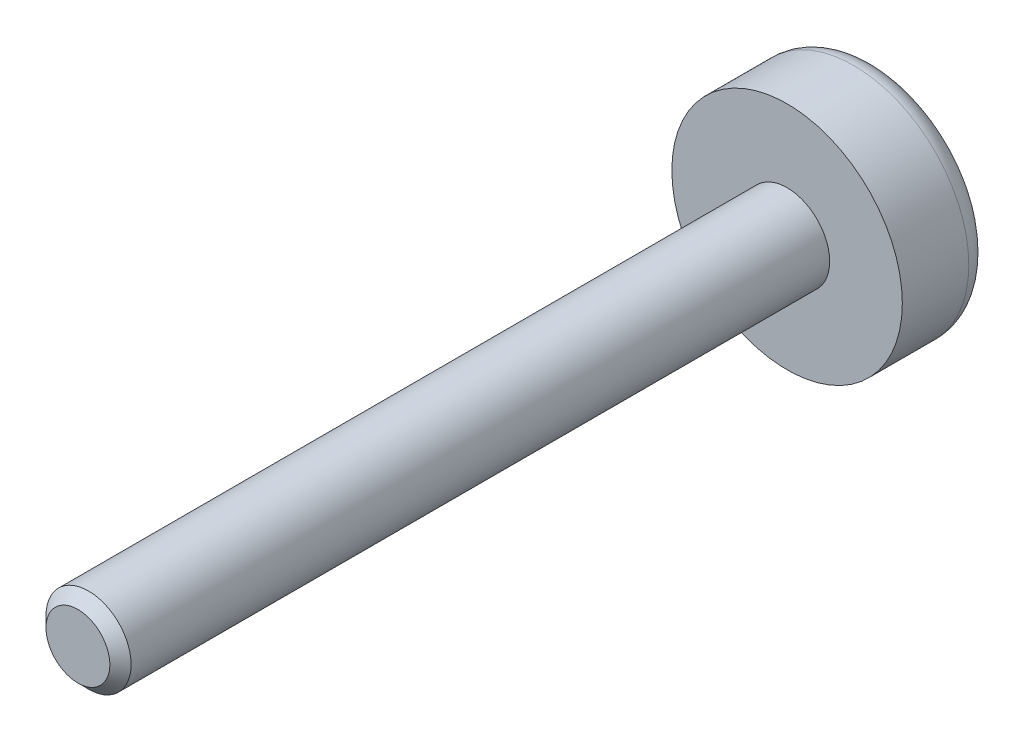
ISO-10303-21;
HEADER;
FILE_DESCRIPTION(('STEP AP214'),'2;1');
FILE_NAME('part.step','',(''),(''),'','','');
FILE_SCHEMA(('AUTOMOTIVE_DESIGN { 1 0 10303 214 1 1 1 1 }'));
ENDSEC;
DATA;
#1=APPLICATION_CONTEXT('core data for automotive mechanical design processes');
#2=APPLICATION_PROTOCOL_DEFINITION('international standard','automotive_design',2000,#1);
#3=PRODUCT_CONTEXT('',#1,'mechanical');
#4=PRODUCT('Part','Part','',(#3));
#5=PRODUCT_RELATED_PRODUCT_CATEGORY('part','',(#4));
#6=PRODUCT_DEFINITION_FORMATION('','',#4);
#7=PRODUCT_DEFINITION_CONTEXT('part definition',#1,'design');
#8=PRODUCT_DEFINITION('design','',#6,#7);
#9=PRODUCT_DEFINITION_SHAPE('','',#8);
#10=(LENGTH_UNIT() NAMED_UNIT(*) SI_UNIT(.MILLI.,.METRE.));
#11=(NAMED_UNIT(*) PLANE_ANGLE_UNIT() SI_UNIT($,.RADIAN.));
#12=(NAMED_UNIT(*) SI_UNIT($,.STERADIAN.) SOLID_ANGLE_UNIT());
#13=UNCERTAINTY_MEASURE_WITH_UNIT(LENGTH_MEASURE(1.E-05),#10,'distance_accuracy_value','');
#14=(GEOMETRIC_REPRESENTATION_CONTEXT(3) GLOBAL_UNCERTAINTY_ASSIGNED_CONTEXT((#13)) GLOBAL_UNIT_ASSIGNED_CONTEXT((#10,
#11,#12)) REPRESENTATION_CONTEXT('',''));
#15=CARTESIAN_POINT('',(0.,0.,0.));
#16=DIRECTION('',(0.,0.,1.));
#17=DIRECTION('',(1.,0.,0.));
#18=AXIS2_PLACEMENT_3D('',#15,#16,#17);
#19=CARTESIAN_POINT('',(0.,0.,20.));
#20=DIRECTION('',(0.,0.,1.));
#21=DIRECTION('',(-1.,0.,0.));
#22=AXIS2_PLACEMENT_3D('',#19,#20,#21);
#23=PLANE('',#22);
#24=CARTESIAN_POINT('',(0.,0.,20.));
#25=DIRECTION('',(0.,0.,-1.));
#26=DIRECTION('',(-1.,0.,0.));
#27=AXIS2_PLACEMENT_3D('',#24,#25,#26);
#28=CIRCLE('',#27,0.900000000000005);
#29=CARTESIAN_POINT('',(-0.900000000000005,0.,20.));
#30=VERTEX_POINT('',#29);
#31=EDGE_CURVE('E140',#30,#30,#28,.T.);
#32=ORIENTED_EDGE('',*,*,#31,.F.);
#33=EDGE_LOOP('',(#32));
#34=FACE_BOUND('',#33,.T.);
#35=ADVANCED_FACE('F41',(#34),#23,.T.);
#36=CARTESIAN_POINT('',(0.,0.,-10.123));
#37=DIRECTION('',(0.,0.,-1.));
#38=DIRECTION('',(1.,0.,0.));
#39=AXIS2_PLACEMENT_3D('',#36,#37,#38);
#40=CYLINDRICAL_SURFACE('',#39,1.2);
#41=CARTESIAN_POINT('',(0.,0.,19.7));
#42=DIRECTION('',(0.,0.,-1.));
#43=DIRECTION('',(-1.,0.,0.));
#44=AXIS2_PLACEMENT_3D('',#41,#42,#43);
#45=CIRCLE('',#44,1.2);
#46=CARTESIAN_POINT('',(-1.2,0.,19.7));
#47=VERTEX_POINT('',#46);
#48=EDGE_CURVE('E137',#47,#47,#45,.F.);
#49=ORIENTED_EDGE('',*,*,#48,.F.);
#50=EDGE_LOOP('',(#49));
#51=FACE_BOUND('',#50,.T.);
#52=CARTESIAN_POINT('',(0.,0.,0.));
#53=DIRECTION('',(0.,0.,1.));
#54=DIRECTION('',(1.,0.,0.));
#55=AXIS2_PLACEMENT_3D('',#52,#53,#54);
#56=CIRCLE('',#55,1.2);
#57=CARTESIAN_POINT('',(1.2,0.,0.));
#58=VERTEX_POINT('',#57);
#59=EDGE_CURVE('E134',#58,#58,#56,.T.);
#60=ORIENTED_EDGE('',*,*,#59,.T.);
#61=EDGE_LOOP('',(#60));
#62=FACE_BOUND('',#61,.T.);
#63=ADVANCED_FACE('F163',(#51,#62),#40,.T.);
#64=CARTESIAN_POINT('',(1.2,0.,0.));
#65=DIRECTION('',(0.,0.,1.));
#66=DIRECTION('',(-1.,0.,0.));
#67=AXIS2_PLACEMENT_3D('',#64,#65,#66);
#68=PLANE('',#67);
#69=ORIENTED_EDGE('',*,*,#59,.F.);
#70=EDGE_LOOP('',(#69));
#71=FACE_BOUND('',#70,.T.);
#72=CARTESIAN_POINT('',(0.,0.,0.));
#73=DIRECTION('',(0.,0.,1.));
#74=DIRECTION('',(1.,0.,0.));
#75=AXIS2_PLACEMENT_3D('',#72,#73,#74);
#76=CIRCLE('',#75,3.25);
#77=CARTESIAN_POINT('',(3.25,0.,0.));
#78=VERTEX_POINT('',#77);
#79=EDGE_CURVE('E131',#78,#78,#76,.T.);
#80=ORIENTED_EDGE('',*,*,#79,.T.);
#81=EDGE_LOOP('',(#80));
#82=FACE_BOUND('',#81,.T.);
#83=ADVANCED_FACE('F157',(#71,#82),#68,.T.);
#84=CARTESIAN_POINT('',(0.,0.,-10.123));
#85=DIRECTION('',(0.,0.,-1.));
#86=DIRECTION('',(1.,0.,0.));
#87=AXIS2_PLACEMENT_3D('',#84,#85,#86);
#88=CYLINDRICAL_SURFACE('',#87,3.25);
#89=CARTESIAN_POINT('',(0.,0.,-1.875));
#90=DIRECTION('',(0.,0.,1.));
#91=DIRECTION('',(1.,0.,0.));
#92=AXIS2_PLACEMENT_3D('',#89,#90,#91);
#93=CIRCLE('',#92,3.25);
#94=CARTESIAN_POINT('',(3.25,0.,-1.875));
#95=VERTEX_POINT('',#94);
#96=EDGE_CURVE('E11',#95,#95,#93,.F.);
#97=ORIENTED_EDGE('',*,*,#96,.F.);
#98=EDGE_LOOP('',(#97));
#99=FACE_BOUND('',#98,.T.);
#100=ORIENTED_EDGE('',*,*,#79,.F.);
#101=EDGE_LOOP('',(#100));
#102=FACE_BOUND('',#101,.T.);
#103=ADVANCED_FACE('F149',(#99,#102),#88,.T.);
#104=CARTESIAN_POINT('',(3.25,0.,-2.5));
#105=DIRECTION('',(0.,0.,-1.));
#106=DIRECTION('',(1.,0.,0.));
#107=AXIS2_PLACEMENT_3D('',#104,#105,#106);
#108=PLANE('',#107);
#109=DIRECTION('',(0.499999999999995,0.866025403784441,0.));
#110=VECTOR('',#109,1.);
#111=CARTESIAN_POINT('',(0.577350269189637,-0.999999999999993,-2.5));
#112=LINE('',#111,#110);
#113=CARTESIAN_POINT('',(0.577350269189637,-0.999999999999993,-2.5));
#114=VERTEX_POINT('',#113);
#115=CARTESIAN_POINT('',(1.15470053837925,0.,-2.5));
#116=VERTEX_POINT('',#115);
#117=EDGE_CURVE('E315',#114,#116,#112,.T.);
#118=ORIENTED_EDGE('',*,*,#117,.T.);
#119=DIRECTION('',(-0.500000000000001,0.866025403784438,0.));
#120=VECTOR('',#119,1.);
#121=CARTESIAN_POINT('',(1.15470053837925,0.,-2.5));
#122=LINE('',#121,#120);
#123=CARTESIAN_POINT('',(0.577350269189624,1.,-2.5));
#124=VERTEX_POINT('',#123);
#125=EDGE_CURVE('E310',#116,#124,#122,.T.);
#126=ORIENTED_EDGE('',*,*,#125,.T.);
#127=DIRECTION('',(-1.,0.,0.));
#128=VECTOR('',#127,1.);
#129=CARTESIAN_POINT('',(0.577350269189624,1.,-2.5));
#130=LINE('',#129,#128);
#131=CARTESIAN_POINT('',(-0.57735026918963,0.999999999999998,-2.5));
#132=VERTEX_POINT('',#131);
#133=EDGE_CURVE('E314',#124,#132,#130,.T.);
#134=ORIENTED_EDGE('',*,*,#133,.T.);
#135=DIRECTION('',(-0.499999999999995,-0.866025403784442,0.));
#136=VECTOR('',#135,1.);
#137=CARTESIAN_POINT('',(-0.57735026918963,0.999999999999998,-2.5));
#138=LINE('',#137,#136);
#139=CARTESIAN_POINT('',(-1.15470053837925,0.,-2.5));
#140=VERTEX_POINT('',#139);
#141=EDGE_CURVE('E322',#132,#140,#138,.T.);
#142=ORIENTED_EDGE('',*,*,#141,.T.);
#143=DIRECTION('',(0.500000000000007,-0.866025403784434,0.));
#144=VECTOR('',#143,1.);
#145=CARTESIAN_POINT('',(-1.15470053837925,0.,-2.5));
#146=LINE('',#145,#144);
#147=CARTESIAN_POINT('',(-0.577350269189617,-1.00000000000001,-2.5));
#148=VERTEX_POINT('',#147);
#149=EDGE_CURVE('E120',#140,#148,#146,.T.);
#150=ORIENTED_EDGE('',*,*,#149,.T.);
#151=DIRECTION('',(1.,0.,0.));
#152=VECTOR('',#151,1.);
#153=CARTESIAN_POINT('',(-0.577350269189617,-1.00000000000001,-2.5));
#154=LINE('',#153,#152);
#155=EDGE_CURVE('E317',#148,#114,#154,.T.);
#156=ORIENTED_EDGE('',*,*,#155,.T.);
#157=EDGE_LOOP('',(#118,#126,#134,#142,#150,#156));
#158=FACE_BOUND('',#157,.T.);
#159=CARTESIAN_POINT('',(0.,0.,-2.5));
#160=DIRECTION('',(0.,0.,1.));
#161=DIRECTION('',(1.,0.,0.));
#162=AXIS2_PLACEMENT_3D('',#159,#160,#161);
#163=CIRCLE('',#162,2.625);
#164=CARTESIAN_POINT('',(2.625,0.,-2.5));
#165=VERTEX_POINT('',#164);
#166=EDGE_CURVE('E49',#165,#165,#163,.T.);
#167=ORIENTED_EDGE('',*,*,#166,.F.);
#168=EDGE_LOOP('',(#167));
#169=FACE_BOUND('',#168,.T.);
#170=ADVANCED_FACE('F146',(#158,#169),#108,.T.);
#171=CARTESIAN_POINT('',(0.,0.,19.7));
#172=DIRECTION('',(0.,0.,-1.));
#173=DIRECTION('',(1.,0.,0.));
#174=AXIS2_PLACEMENT_3D('',#171,#172,#173);
#175=CONICAL_SURFACE('',#174,1.2,0.785398163397443);
#176=ORIENTED_EDGE('',*,*,#31,.T.);
#177=EDGE_LOOP('',(#176));
#178=FACE_BOUND('',#177,.T.);
#179=ORIENTED_EDGE('',*,*,#48,.T.);
#180=EDGE_LOOP('',(#179));
#181=FACE_BOUND('',#180,.T.);
#182=ADVANCED_FACE('F148',(#178,#181),#175,.T.);
#183=CARTESIAN_POINT('',(0.,0.,-1.875));
#184=DIRECTION('',(0.,0.,-1.));
#185=DIRECTION('',(1.,0.,0.));
#186=AXIS2_PLACEMENT_3D('',#183,#184,#185);
#187=TOROIDAL_SURFACE('',#186,2.625,0.625);
#188=ORIENTED_EDGE('',*,*,#96,.T.);
#189=EDGE_LOOP('',(#188));
#190=FACE_BOUND('',#189,.T.);
#191=ORIENTED_EDGE('',*,*,#166,.T.);
#192=EDGE_LOOP('',(#191));
#193=FACE_BOUND('',#192,.T.);
#194=ADVANCED_FACE('F43',(#190,#193),#187,.T.);
#195=CARTESIAN_POINT('',(0.577350269189637,-0.999999999999993,-1.125));
#196=DIRECTION('',(0.866025403784441,-0.499999999999995,0.));
#197=DIRECTION('',(0.499999999999995,0.866025403784441,0.));
#198=AXIS2_PLACEMENT_3D('',#195,#196,#197);
#199=PLANE('',#198);
#200=ORIENTED_EDGE('',*,*,#117,.F.);
#201=DIRECTION('',(0.,0.,-1.));
#202=VECTOR('',#201,1.);
#203=CARTESIAN_POINT('',(0.577350269189637,-0.999999999999993,-1.125));
#204=LINE('',#203,#202);
#205=CARTESIAN_POINT('',(0.577350269189637,-0.999999999999993,-1.125));
#206=VERTEX_POINT('',#205);
#207=EDGE_CURVE('E87',#206,#114,#204,.T.);
#208=ORIENTED_EDGE('',*,*,#207,.F.);
#209=DIRECTION('',(0.499999999999995,0.866025403784441,0.));
#210=VECTOR('',#209,1.);
#211=CARTESIAN_POINT('',(0.577350269189637,-0.999999999999993,-1.125));
#212=LINE('',#211,#210);
#213=CARTESIAN_POINT('',(1.15470053837925,0.,-1.125));
#214=VERTEX_POINT('',#213);
#215=EDGE_CURVE('E325',#206,#214,#212,.T.);
#216=ORIENTED_EDGE('',*,*,#215,.T.);
#217=DIRECTION('',(0.,0.,-1.));
#218=VECTOR('',#217,1.);
#219=CARTESIAN_POINT('',(1.15470053837925,0.,-1.125));
#220=LINE('',#219,#218);
#221=EDGE_CURVE('E56',#214,#116,#220,.T.);
#222=ORIENTED_EDGE('',*,*,#221,.T.);
#223=EDGE_LOOP('',(#200,#208,#216,#222));
#224=FACE_BOUND('',#223,.T.);
#225=ADVANCED_FACE('F210',(#224),#199,.F.);
#226=CARTESIAN_POINT('',(-0.577350269189617,-1.00000000000001,-1.125));
#227=DIRECTION('',(0.,-1.,0.));
#228=DIRECTION('',(1.,0.,0.));
#229=AXIS2_PLACEMENT_3D('',#226,#227,#228);
#230=PLANE('',#229);
#231=ORIENTED_EDGE('',*,*,#155,.F.);
#232=DIRECTION('',(0.,0.,-1.));
#233=VECTOR('',#232,1.);
#234=CARTESIAN_POINT('',(-0.577350269189617,-1.00000000000001,-1.125));
#235=LINE('',#234,#233);
#236=CARTESIAN_POINT('',(-0.577350269189617,-1.00000000000001,-1.125));
#237=VERTEX_POINT('',#236);
#238=EDGE_CURVE('E122',#237,#148,#235,.T.);
#239=ORIENTED_EDGE('',*,*,#238,.F.);
#240=DIRECTION('',(1.,0.,0.));
#241=VECTOR('',#240,1.);
#242=CARTESIAN_POINT('',(-0.577350269189617,-1.00000000000001,-1.125));
#243=LINE('',#242,#241);
#244=EDGE_CURVE('E65',#237,#206,#243,.T.);
#245=ORIENTED_EDGE('',*,*,#244,.T.);
#246=ORIENTED_EDGE('',*,*,#207,.T.);
#247=EDGE_LOOP('',(#231,#239,#245,#246));
#248=FACE_BOUND('',#247,.T.);
#249=ADVANCED_FACE('F220',(#248),#230,.F.);
#250=CARTESIAN_POINT('',(-1.15470053837925,0.,-1.125));
#251=DIRECTION('',(-0.866025403784435,-0.500000000000007,0.));
#252=DIRECTION('',(0.500000000000007,-0.866025403784435,0.));
#253=AXIS2_PLACEMENT_3D('',#250,#251,#252);
#254=PLANE('',#253);
#255=ORIENTED_EDGE('',*,*,#149,.F.);
#256=DIRECTION('',(0.,0.,-1.));
#257=VECTOR('',#256,1.);
#258=CARTESIAN_POINT('',(-1.15470053837925,0.,-1.125));
#259=LINE('',#258,#257);
#260=CARTESIAN_POINT('',(-1.15470053837925,0.,-1.125));
#261=VERTEX_POINT('',#260);
#262=EDGE_CURVE('E109',#261,#140,#259,.T.);
#263=ORIENTED_EDGE('',*,*,#262,.F.);
#264=DIRECTION('',(0.500000000000007,-0.866025403784434,0.));
#265=VECTOR('',#264,1.);
#266=CARTESIAN_POINT('',(-1.15470053837925,0.,-1.125));
#267=LINE('',#266,#265);
#268=EDGE_CURVE('E112',#261,#237,#267,.T.);
#269=ORIENTED_EDGE('',*,*,#268,.T.);
#270=ORIENTED_EDGE('',*,*,#238,.T.);
#271=EDGE_LOOP('',(#255,#263,#269,#270));
#272=FACE_BOUND('',#271,.T.);
#273=ADVANCED_FACE('F118',(#272),#254,.F.);
#274=CARTESIAN_POINT('',(-0.57735026918963,0.999999999999998,-1.125));
#275=DIRECTION('',(-0.866025403784442,0.499999999999995,0.));
#276=DIRECTION('',(-0.499999999999995,-0.866025403784441,0.));
#277=AXIS2_PLACEMENT_3D('',#274,#275,#276);
#278=PLANE('',#277);
#279=ORIENTED_EDGE('',*,*,#141,.F.);
#280=DIRECTION('',(0.,0.,-1.));
#281=VECTOR('',#280,1.);
#282=CARTESIAN_POINT('',(-0.57735026918963,0.999999999999998,-1.125));
#283=LINE('',#282,#281);
#284=CARTESIAN_POINT('',(-0.57735026918963,0.999999999999998,-1.125));
#285=VERTEX_POINT('',#284);
#286=EDGE_CURVE('E111',#285,#132,#283,.T.);
#287=ORIENTED_EDGE('',*,*,#286,.F.);
#288=DIRECTION('',(-0.499999999999995,-0.866025403784442,0.));
#289=VECTOR('',#288,1.);
#290=CARTESIAN_POINT('',(-0.57735026918963,0.999999999999998,-1.125));
#291=LINE('',#290,#289);
#292=EDGE_CURVE('E104',#285,#261,#291,.T.);
#293=ORIENTED_EDGE('',*,*,#292,.T.);
#294=ORIENTED_EDGE('',*,*,#262,.T.);
#295=EDGE_LOOP('',(#279,#287,#293,#294));
#296=FACE_BOUND('',#295,.T.);
#297=ADVANCED_FACE('F107',(#296),#278,.F.);
#298=CARTESIAN_POINT('',(0.577350269189624,1.,-1.125));
#299=DIRECTION('',(0.,1.,0.));
#300=DIRECTION('',(-1.,0.,0.));
#301=AXIS2_PLACEMENT_3D('',#298,#299,#300);
#302=PLANE('',#301);
#303=ORIENTED_EDGE('',*,*,#133,.F.);
#304=DIRECTION('',(0.,0.,-1.));
#305=VECTOR('',#304,1.);
#306=CARTESIAN_POINT('',(0.577350269189624,1.,-1.125));
#307=LINE('',#306,#305);
#308=CARTESIAN_POINT('',(0.577350269189624,1.,-1.125));
#309=VERTEX_POINT('',#308);
#310=EDGE_CURVE('E125',#309,#124,#307,.T.);
#311=ORIENTED_EDGE('',*,*,#310,.F.);
#312=DIRECTION('',(-1.,0.,0.));
#313=VECTOR('',#312,1.);
#314=CARTESIAN_POINT('',(0.577350269189624,1.,-1.125));
#315=LINE('',#314,#313);
#316=EDGE_CURVE('E113',#309,#285,#315,.T.);
#317=ORIENTED_EDGE('',*,*,#316,.T.);
#318=ORIENTED_EDGE('',*,*,#286,.T.);
#319=EDGE_LOOP('',(#303,#311,#317,#318));
#320=FACE_BOUND('',#319,.T.);
#321=ADVANCED_FACE('F247',(#320),#302,.F.);
#322=CARTESIAN_POINT('',(1.15470053837925,0.,-1.125));
#323=DIRECTION('',(0.866025403784438,0.500000000000001,0.));
#324=DIRECTION('',(-0.500000000000001,0.866025403784438,0.));
#325=AXIS2_PLACEMENT_3D('',#322,#323,#324);
#326=PLANE('',#325);
#327=ORIENTED_EDGE('',*,*,#125,.F.);
#328=ORIENTED_EDGE('',*,*,#221,.F.);
#329=DIRECTION('',(-0.500000000000001,0.866025403784438,0.));
#330=VECTOR('',#329,1.);
#331=CARTESIAN_POINT('',(1.15470053837925,0.,-1.125));
#332=LINE('',#331,#330);
#333=EDGE_CURVE('E95',#214,#309,#332,.T.);
#334=ORIENTED_EDGE('',*,*,#333,.T.);
#335=ORIENTED_EDGE('',*,*,#310,.T.);
#336=EDGE_LOOP('',(#327,#328,#334,#335));
#337=FACE_BOUND('',#336,.T.);
#338=ADVANCED_FACE('F257',(#337),#326,.F.);
#339=CARTESIAN_POINT('',(0.,0.,-1.125));
#340=DIRECTION('',(0.,0.,-1.));
#341=DIRECTION('',(1.,0.,0.));
#342=AXIS2_PLACEMENT_3D('',#339,#340,#341);
#343=PLANE('',#342);
#344=ORIENTED_EDGE('',*,*,#215,.F.);
#345=ORIENTED_EDGE('',*,*,#244,.F.);
#346=ORIENTED_EDGE('',*,*,#268,.F.);
#347=ORIENTED_EDGE('',*,*,#292,.F.);
#348=ORIENTED_EDGE('',*,*,#316,.F.);
#349=ORIENTED_EDGE('',*,*,#333,.F.);
#350=EDGE_LOOP('',(#344,#345,#346,#347,#348,#349));
#351=FACE_BOUND('',#350,.T.);
#352=ADVANCED_FACE('F115',(#351),#343,.T.);
#353=CLOSED_SHELL('',(#35,#63,#83,#103,#170,#182,#194,#225,#249,#273,#297,#321,#338,#352));
#354=MANIFOLD_SOLID_BREP('B2',#353);
#355=ADVANCED_BREP_SHAPE_REPRESENTATION('',(#18,#354),#14);
#356=SHAPE_DEFINITION_REPRESENTATION(#9,#355);
ENDSEC;
END-ISO-10303-21;
